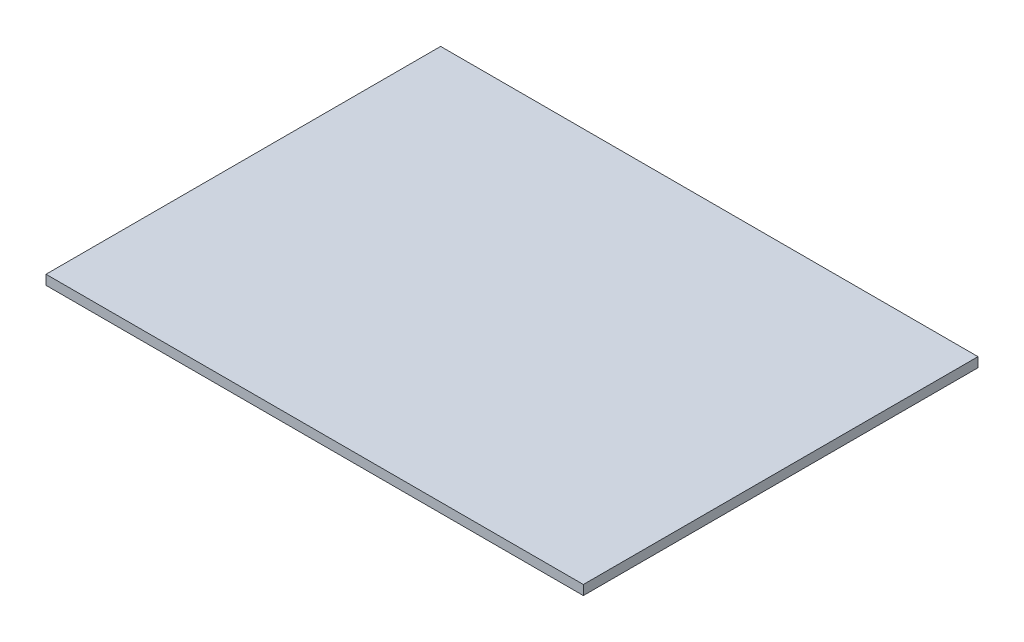
ISO-10303-21;
HEADER;
FILE_DESCRIPTION(('STEP AP214'),'2;1');
FILE_NAME('part.step','',(''),(''),'','','');
FILE_SCHEMA(('AUTOMOTIVE_DESIGN { 1 0 10303 214 1 1 1 1 }'));
ENDSEC;
DATA;
#1=APPLICATION_CONTEXT('core data for automotive mechanical design processes');
#2=APPLICATION_PROTOCOL_DEFINITION('international standard','automotive_design',2000,#1);
#3=PRODUCT_CONTEXT('',#1,'mechanical');
#4=PRODUCT('Part','Part','',(#3));
#5=PRODUCT_RELATED_PRODUCT_CATEGORY('part','',(#4));
#6=PRODUCT_DEFINITION_FORMATION('','',#4);
#7=PRODUCT_DEFINITION_CONTEXT('part definition',#1,'design');
#8=PRODUCT_DEFINITION('design','',#6,#7);
#9=PRODUCT_DEFINITION_SHAPE('','',#8);
#10=(LENGTH_UNIT() NAMED_UNIT(*) SI_UNIT(.MILLI.,.METRE.));
#11=(NAMED_UNIT(*) PLANE_ANGLE_UNIT() SI_UNIT($,.RADIAN.));
#12=(NAMED_UNIT(*) SI_UNIT($,.STERADIAN.) SOLID_ANGLE_UNIT());
#13=UNCERTAINTY_MEASURE_WITH_UNIT(LENGTH_MEASURE(1.E-05),#10,'distance_accuracy_value','');
#14=(GEOMETRIC_REPRESENTATION_CONTEXT(3) GLOBAL_UNCERTAINTY_ASSIGNED_CONTEXT((#13)) GLOBAL_UNIT_ASSIGNED_CONTEXT((#10,
#11,#12)) REPRESENTATION_CONTEXT('',''));
#15=CARTESIAN_POINT('',(0.,0.,0.));
#16=DIRECTION('',(0.,0.,1.));
#17=DIRECTION('',(1.,0.,0.));
#18=AXIS2_PLACEMENT_3D('',#15,#16,#17);
#19=CARTESIAN_POINT('',(-141.694249464492,2.54,0.));
#20=DIRECTION('',(0.,0.,-1.));
#21=DIRECTION('',(-1.,0.,0.));
#22=AXIS2_PLACEMENT_3D('',#19,#20,#21);
#23=PLANE('',#22);
#24=DIRECTION('',(1.,0.,0.));
#25=VECTOR('',#24,1.);
#26=CARTESIAN_POINT('',(-141.694249464492,0.,0.));
#27=LINE('',#26,#25);
#28=CARTESIAN_POINT('',(-141.694249464492,0.,0.));
#29=VERTEX_POINT('',#28);
#30=CARTESIAN_POINT('',(0.,0.,0.));
#31=VERTEX_POINT('',#30);
#32=EDGE_CURVE('E96',#29,#31,#27,.T.);
#33=ORIENTED_EDGE('',*,*,#32,.T.);
#34=DIRECTION('',(0.,-1.,0.));
#35=VECTOR('',#34,1.);
#36=CARTESIAN_POINT('',(0.,2.54,0.));
#37=LINE('',#36,#35);
#38=CARTESIAN_POINT('',(0.,2.54,0.));
#39=VERTEX_POINT('',#38);
#40=EDGE_CURVE('E11',#39,#31,#37,.T.);
#41=ORIENTED_EDGE('',*,*,#40,.F.);
#42=DIRECTION('',(1.,0.,0.));
#43=VECTOR('',#42,1.);
#44=CARTESIAN_POINT('',(-141.694249464492,2.54,0.));
#45=LINE('',#44,#43);
#46=CARTESIAN_POINT('',(-141.694249464492,2.54,0.));
#47=VERTEX_POINT('',#46);
#48=EDGE_CURVE('E84',#47,#39,#45,.T.);
#49=ORIENTED_EDGE('',*,*,#48,.F.);
#50=DIRECTION('',(0.,-1.,0.));
#51=VECTOR('',#50,1.);
#52=CARTESIAN_POINT('',(-141.694249464492,2.54,0.));
#53=LINE('',#52,#51);
#54=EDGE_CURVE('E92',#47,#29,#53,.T.);
#55=ORIENTED_EDGE('',*,*,#54,.T.);
#56=EDGE_LOOP('',(#33,#41,#49,#55));
#57=FACE_BOUND('',#56,.T.);
#58=ADVANCED_FACE('F33',(#57),#23,.F.);
#59=CARTESIAN_POINT('',(0.,2.54,0.));
#60=DIRECTION('',(-1.,0.,0.));
#61=DIRECTION('',(0.,0.,1.));
#62=AXIS2_PLACEMENT_3D('',#59,#60,#61);
#63=PLANE('',#62);
#64=DIRECTION('',(0.,0.,-1.));
#65=VECTOR('',#64,1.);
#66=CARTESIAN_POINT('',(0.,0.,0.));
#67=LINE('',#66,#65);
#68=CARTESIAN_POINT('',(0.,0.,-104.060899653979));
#69=VERTEX_POINT('',#68);
#70=EDGE_CURVE('E88',#31,#69,#67,.T.);
#71=ORIENTED_EDGE('',*,*,#70,.T.);
#72=DIRECTION('',(0.,-1.,0.));
#73=VECTOR('',#72,1.);
#74=CARTESIAN_POINT('',(0.,2.54,-104.060899653979));
#75=LINE('',#74,#73);
#76=CARTESIAN_POINT('',(0.,2.54,-104.060899653979));
#77=VERTEX_POINT('',#76);
#78=EDGE_CURVE('E41',#77,#69,#75,.T.);
#79=ORIENTED_EDGE('',*,*,#78,.F.);
#80=DIRECTION('',(0.,0.,-1.));
#81=VECTOR('',#80,1.);
#82=CARTESIAN_POINT('',(0.,2.54,0.));
#83=LINE('',#82,#81);
#84=EDGE_CURVE('E79',#39,#77,#83,.T.);
#85=ORIENTED_EDGE('',*,*,#84,.F.);
#86=ORIENTED_EDGE('',*,*,#40,.T.);
#87=EDGE_LOOP('',(#71,#79,#85,#86));
#88=FACE_BOUND('',#87,.T.);
#89=ADVANCED_FACE('F87',(#88),#63,.F.);
#90=CARTESIAN_POINT('',(0.,2.54,-104.060899653979));
#91=DIRECTION('',(0.,0.,1.));
#92=DIRECTION('',(1.,0.,0.));
#93=AXIS2_PLACEMENT_3D('',#90,#91,#92);
#94=PLANE('',#93);
#95=DIRECTION('',(-1.,0.,0.));
#96=VECTOR('',#95,1.);
#97=CARTESIAN_POINT('',(0.,0.,-104.060899653979));
#98=LINE('',#97,#96);
#99=CARTESIAN_POINT('',(-141.694249464492,0.,-104.060899653979));
#100=VERTEX_POINT('',#99);
#101=EDGE_CURVE('E66',#69,#100,#98,.T.);
#102=ORIENTED_EDGE('',*,*,#101,.T.);
#103=DIRECTION('',(0.,-1.,0.));
#104=VECTOR('',#103,1.);
#105=CARTESIAN_POINT('',(-141.694249464492,2.54,-104.060899653979));
#106=LINE('',#105,#104);
#107=CARTESIAN_POINT('',(-141.694249464492,2.54,-104.060899653979));
#108=VERTEX_POINT('',#107);
#109=EDGE_CURVE('E89',#108,#100,#106,.T.);
#110=ORIENTED_EDGE('',*,*,#109,.F.);
#111=DIRECTION('',(-1.,0.,0.));
#112=VECTOR('',#111,1.);
#113=CARTESIAN_POINT('',(0.,2.54,-104.060899653979));
#114=LINE('',#113,#112);
#115=EDGE_CURVE('E82',#77,#108,#114,.T.);
#116=ORIENTED_EDGE('',*,*,#115,.F.);
#117=ORIENTED_EDGE('',*,*,#78,.T.);
#118=EDGE_LOOP('',(#102,#110,#116,#117));
#119=FACE_BOUND('',#118,.T.);
#120=ADVANCED_FACE('F90',(#119),#94,.F.);
#121=CARTESIAN_POINT('',(-141.694249464492,2.54,-104.060899653979));
#122=DIRECTION('',(1.,0.,0.));
#123=DIRECTION('',(0.,0.,-1.));
#124=AXIS2_PLACEMENT_3D('',#121,#122,#123);
#125=PLANE('',#124);
#126=DIRECTION('',(0.,0.,1.));
#127=VECTOR('',#126,1.);
#128=CARTESIAN_POINT('',(-141.694249464492,0.,-104.060899653979));
#129=LINE('',#128,#127);
#130=EDGE_CURVE('E72',#100,#29,#129,.T.);
#131=ORIENTED_EDGE('',*,*,#130,.T.);
#132=ORIENTED_EDGE('',*,*,#54,.F.);
#133=DIRECTION('',(0.,0.,1.));
#134=VECTOR('',#133,1.);
#135=CARTESIAN_POINT('',(-141.694249464492,2.54,-104.060899653979));
#136=LINE('',#135,#134);
#137=EDGE_CURVE('E49',#108,#47,#136,.T.);
#138=ORIENTED_EDGE('',*,*,#137,.F.);
#139=ORIENTED_EDGE('',*,*,#109,.T.);
#140=EDGE_LOOP('',(#131,#132,#138,#139));
#141=FACE_BOUND('',#140,.T.);
#142=ADVANCED_FACE('F103',(#141),#125,.F.);
#143=CARTESIAN_POINT('',(0.,2.54,0.));
#144=DIRECTION('',(0.,1.,0.));
#145=DIRECTION('',(0.,0.,1.));
#146=AXIS2_PLACEMENT_3D('',#143,#144,#145);
#147=PLANE('',#146);
#148=ORIENTED_EDGE('',*,*,#48,.T.);
#149=ORIENTED_EDGE('',*,*,#84,.T.);
#150=ORIENTED_EDGE('',*,*,#115,.T.);
#151=ORIENTED_EDGE('',*,*,#137,.T.);
#152=EDGE_LOOP('',(#148,#149,#150,#151));
#153=FACE_BOUND('',#152,.T.);
#154=ADVANCED_FACE('F80',(#153),#147,.T.);
#155=CARTESIAN_POINT('',(0.,0.,0.));
#156=DIRECTION('',(0.,1.,0.));
#157=DIRECTION('',(0.,0.,1.));
#158=AXIS2_PLACEMENT_3D('',#155,#156,#157);
#159=PLANE('',#158);
#160=ORIENTED_EDGE('',*,*,#32,.F.);
#161=ORIENTED_EDGE('',*,*,#130,.F.);
#162=ORIENTED_EDGE('',*,*,#101,.F.);
#163=ORIENTED_EDGE('',*,*,#70,.F.);
#164=EDGE_LOOP('',(#160,#161,#162,#163));
#165=FACE_BOUND('',#164,.T.);
#166=ADVANCED_FACE('F106',(#165),#159,.F.);
#167=CLOSED_SHELL('',(#58,#89,#120,#142,#154,#166));
#168=MANIFOLD_SOLID_BREP('B2',#167);
#169=ADVANCED_BREP_SHAPE_REPRESENTATION('',(#18,#168),#14);
#170=SHAPE_DEFINITION_REPRESENTATION(#9,#169);
ENDSEC;
END-ISO-10303-21;
